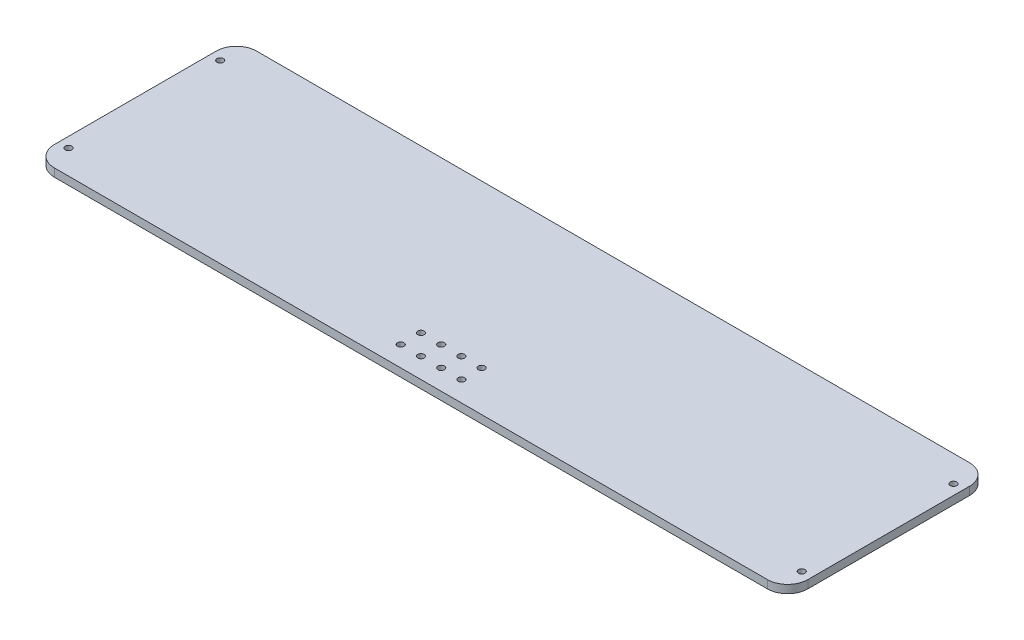
ISO-10303-21;
HEADER;
FILE_DESCRIPTION(('STEP AP214'),'2;1');
FILE_NAME('part.step','',(''),(''),'','','');
FILE_SCHEMA(('AUTOMOTIVE_DESIGN { 1 0 10303 214 1 1 1 1 }'));
ENDSEC;
DATA;
#1=APPLICATION_CONTEXT('core data for automotive mechanical design processes');
#2=APPLICATION_PROTOCOL_DEFINITION('international standard','automotive_design',2000,#1);
#3=PRODUCT_CONTEXT('',#1,'mechanical');
#4=PRODUCT('Part','Part','',(#3));
#5=PRODUCT_RELATED_PRODUCT_CATEGORY('part','',(#4));
#6=PRODUCT_DEFINITION_FORMATION('','',#4);
#7=PRODUCT_DEFINITION_CONTEXT('part definition',#1,'design');
#8=PRODUCT_DEFINITION('design','',#6,#7);
#9=PRODUCT_DEFINITION_SHAPE('','',#8);
#10=(LENGTH_UNIT() NAMED_UNIT(*) SI_UNIT(.MILLI.,.METRE.));
#11=(NAMED_UNIT(*) PLANE_ANGLE_UNIT() SI_UNIT($,.RADIAN.));
#12=(NAMED_UNIT(*) SI_UNIT($,.STERADIAN.) SOLID_ANGLE_UNIT());
#13=UNCERTAINTY_MEASURE_WITH_UNIT(LENGTH_MEASURE(1.E-05),#10,'distance_accuracy_value','');
#14=(GEOMETRIC_REPRESENTATION_CONTEXT(3) GLOBAL_UNCERTAINTY_ASSIGNED_CONTEXT((#13)) GLOBAL_UNIT_ASSIGNED_CONTEXT((#10,
#11,#12)) REPRESENTATION_CONTEXT('',''));
#15=CARTESIAN_POINT('',(0.,0.,0.));
#16=DIRECTION('',(0.,0.,1.));
#17=DIRECTION('',(1.,0.,0.));
#18=AXIS2_PLACEMENT_3D('',#15,#16,#17);
#19=CARTESIAN_POINT('',(-176.25,4.,40.));
#20=DIRECTION('',(0.,1.,0.));
#21=DIRECTION('',(0.,0.,1.));
#22=AXIS2_PLACEMENT_3D('',#19,#20,#21);
#23=PLANE('',#22);
#24=CARTESIAN_POINT('',(15.,4.,30.));
#25=DIRECTION('',(0.,1.,0.));
#26=DIRECTION('',(0.,0.,1.));
#27=AXIS2_PLACEMENT_3D('',#24,#25,#26);
#28=CIRCLE('',#27,1.6);
#29=CARTESIAN_POINT('',(15.,4.,31.6));
#30=VERTEX_POINT('',#29);
#31=EDGE_CURVE('E230',#30,#30,#28,.T.);
#32=ORIENTED_EDGE('',*,*,#31,.F.);
#33=EDGE_LOOP('',(#32));
#34=FACE_BOUND('',#33,.T.);
#35=CARTESIAN_POINT('',(15.,4.,40.));
#36=DIRECTION('',(0.,1.,0.));
#37=DIRECTION('',(0.,0.,1.));
#38=AXIS2_PLACEMENT_3D('',#35,#36,#37);
#39=CIRCLE('',#38,1.6);
#40=CARTESIAN_POINT('',(15.,4.,41.6));
#41=VERTEX_POINT('',#40);
#42=EDGE_CURVE('E224',#41,#41,#39,.T.);
#43=ORIENTED_EDGE('',*,*,#42,.F.);
#44=EDGE_LOOP('',(#43));
#45=FACE_BOUND('',#44,.T.);
#46=CARTESIAN_POINT('',(-15.,4.,40.));
#47=DIRECTION('',(0.,1.,0.));
#48=DIRECTION('',(0.,0.,1.));
#49=AXIS2_PLACEMENT_3D('',#46,#47,#48);
#50=CIRCLE('',#49,1.6);
#51=CARTESIAN_POINT('',(-15.,4.,41.6));
#52=VERTEX_POINT('',#51);
#53=EDGE_CURVE('E218',#52,#52,#50,.T.);
#54=ORIENTED_EDGE('',*,*,#53,.F.);
#55=EDGE_LOOP('',(#54));
#56=FACE_BOUND('',#55,.T.);
#57=CARTESIAN_POINT('',(-5.,4.,30.));
#58=DIRECTION('',(0.,1.,0.));
#59=DIRECTION('',(0.,0.,1.));
#60=AXIS2_PLACEMENT_3D('',#57,#58,#59);
#61=CIRCLE('',#60,1.6);
#62=CARTESIAN_POINT('',(-5.,4.,31.6));
#63=VERTEX_POINT('',#62);
#64=EDGE_CURVE('E211',#63,#63,#61,.T.);
#65=ORIENTED_EDGE('',*,*,#64,.F.);
#66=EDGE_LOOP('',(#65));
#67=FACE_BOUND('',#66,.T.);
#68=CARTESIAN_POINT('',(5.00000000000001,4.,40.));
#69=DIRECTION('',(0.,1.,0.));
#70=DIRECTION('',(0.,0.,1.));
#71=AXIS2_PLACEMENT_3D('',#68,#69,#70);
#72=CIRCLE('',#71,1.6);
#73=CARTESIAN_POINT('',(5.00000000000001,4.,41.6));
#74=VERTEX_POINT('',#73);
#75=EDGE_CURVE('E247',#74,#74,#72,.T.);
#76=ORIENTED_EDGE('',*,*,#75,.F.);
#77=EDGE_LOOP('',(#76));
#78=FACE_BOUND('',#77,.T.);
#79=CARTESIAN_POINT('',(-4.99999999999999,4.,40.));
#80=DIRECTION('',(0.,1.,0.));
#81=DIRECTION('',(0.,0.,1.));
#82=AXIS2_PLACEMENT_3D('',#79,#80,#81);
#83=CIRCLE('',#82,1.6);
#84=CARTESIAN_POINT('',(-4.99999999999999,4.,41.6));
#85=VERTEX_POINT('',#84);
#86=EDGE_CURVE('E235',#85,#85,#83,.T.);
#87=ORIENTED_EDGE('',*,*,#86,.F.);
#88=EDGE_LOOP('',(#87));
#89=FACE_BOUND('',#88,.T.);
#90=CARTESIAN_POINT('',(5.,4.,30.));
#91=DIRECTION('',(0.,1.,0.));
#92=DIRECTION('',(0.,0.,1.));
#93=AXIS2_PLACEMENT_3D('',#90,#91,#92);
#94=CIRCLE('',#93,1.6);
#95=CARTESIAN_POINT('',(5.,4.,31.6));
#96=VERTEX_POINT('',#95);
#97=EDGE_CURVE('E242',#96,#96,#94,.T.);
#98=ORIENTED_EDGE('',*,*,#97,.F.);
#99=EDGE_LOOP('',(#98));
#100=FACE_BOUND('',#99,.T.);
#101=CARTESIAN_POINT('',(-15.,4.,30.));
#102=DIRECTION('',(0.,1.,0.));
#103=DIRECTION('',(0.,0.,1.));
#104=AXIS2_PLACEMENT_3D('',#101,#102,#103);
#105=CIRCLE('',#104,1.6);
#106=CARTESIAN_POINT('',(-15.,4.,31.6));
#107=VERTEX_POINT('',#106);
#108=EDGE_CURVE('E205',#107,#107,#105,.T.);
#109=ORIENTED_EDGE('',*,*,#108,.F.);
#110=EDGE_LOOP('',(#109));
#111=FACE_BOUND('',#110,.T.);
#112=CARTESIAN_POINT('',(-181.25,4.,38.));
#113=DIRECTION('',(0.,1.,0.));
#114=DIRECTION('',(0.,0.,-1.));
#115=AXIS2_PLACEMENT_3D('',#112,#113,#114);
#116=CIRCLE('',#115,1.59999999999999);
#117=CARTESIAN_POINT('',(-181.25,4.,36.4));
#118=VERTEX_POINT('',#117);
#119=EDGE_CURVE('E190',#118,#118,#116,.T.);
#120=ORIENTED_EDGE('',*,*,#119,.F.);
#121=EDGE_LOOP('',(#120));
#122=FACE_BOUND('',#121,.T.);
#123=CARTESIAN_POINT('',(181.25,4.,38.));
#124=DIRECTION('',(0.,1.,0.));
#125=DIRECTION('',(0.,0.,1.));
#126=AXIS2_PLACEMENT_3D('',#123,#124,#125);
#127=CIRCLE('',#126,1.59999999999999);
#128=CARTESIAN_POINT('',(181.25,4.,39.6));
#129=VERTEX_POINT('',#128);
#130=EDGE_CURVE('E136',#129,#129,#127,.T.);
#131=ORIENTED_EDGE('',*,*,#130,.F.);
#132=EDGE_LOOP('',(#131));
#133=FACE_BOUND('',#132,.T.);
#134=CARTESIAN_POINT('',(-176.25,4.,40.));
#135=DIRECTION('',(0.,1.,0.));
#136=DIRECTION('',(0.,0.,1.));
#137=AXIS2_PLACEMENT_3D('',#134,#135,#136);
#138=CIRCLE('',#137,10.);
#139=CARTESIAN_POINT('',(-186.25,4.,39.9999999999999));
#140=VERTEX_POINT('',#139);
#141=CARTESIAN_POINT('',(-176.25,4.,50.));
#142=VERTEX_POINT('',#141);
#143=EDGE_CURVE('E147',#140,#142,#138,.T.);
#144=ORIENTED_EDGE('',*,*,#143,.T.);
#145=DIRECTION('',(1.,0.,0.));
#146=VECTOR('',#145,1.);
#147=CARTESIAN_POINT('',(-176.25,4.,50.));
#148=LINE('',#147,#146);
#149=CARTESIAN_POINT('',(176.25,4.,50.));
#150=VERTEX_POINT('',#149);
#151=EDGE_CURVE('E95',#142,#150,#148,.T.);
#152=ORIENTED_EDGE('',*,*,#151,.T.);
#153=CARTESIAN_POINT('',(176.25,4.,40.));
#154=DIRECTION('',(0.,1.,0.));
#155=DIRECTION('',(0.,0.,1.));
#156=AXIS2_PLACEMENT_3D('',#153,#154,#155);
#157=CIRCLE('',#156,10.);
#158=CARTESIAN_POINT('',(186.25,4.,39.9999999999999));
#159=VERTEX_POINT('',#158);
#160=EDGE_CURVE('E162',#150,#159,#157,.T.);
#161=ORIENTED_EDGE('',*,*,#160,.T.);
#162=DIRECTION('',(0.,0.,-1.));
#163=VECTOR('',#162,1.);
#164=CARTESIAN_POINT('',(186.25,4.,-39.9999999999999));
#165=LINE('',#164,#163);
#166=CARTESIAN_POINT('',(186.25,4.,-39.9999999999999));
#167=VERTEX_POINT('',#166);
#168=EDGE_CURVE('E175',#159,#167,#165,.T.);
#169=ORIENTED_EDGE('',*,*,#168,.T.);
#170=CARTESIAN_POINT('',(176.25,4.,-40.));
#171=DIRECTION('',(0.,1.,0.));
#172=DIRECTION('',(0.,0.,-1.));
#173=AXIS2_PLACEMENT_3D('',#170,#171,#172);
#174=CIRCLE('',#173,10.);
#175=CARTESIAN_POINT('',(176.25,4.,-50.));
#176=VERTEX_POINT('',#175);
#177=EDGE_CURVE('E114',#167,#176,#174,.T.);
#178=ORIENTED_EDGE('',*,*,#177,.T.);
#179=DIRECTION('',(-1.,0.,0.));
#180=VECTOR('',#179,1.);
#181=CARTESIAN_POINT('',(-176.25,4.,-50.));
#182=LINE('',#181,#180);
#183=CARTESIAN_POINT('',(-176.25,4.,-50.));
#184=VERTEX_POINT('',#183);
#185=EDGE_CURVE('E108',#176,#184,#182,.T.);
#186=ORIENTED_EDGE('',*,*,#185,.T.);
#187=CARTESIAN_POINT('',(-176.25,4.,-40.));
#188=DIRECTION('',(0.,1.,0.));
#189=DIRECTION('',(0.,0.,1.));
#190=AXIS2_PLACEMENT_3D('',#187,#188,#189);
#191=CIRCLE('',#190,10.);
#192=CARTESIAN_POINT('',(-186.25,4.,-39.9999999999999));
#193=VERTEX_POINT('',#192);
#194=EDGE_CURVE('E112',#184,#193,#191,.T.);
#195=ORIENTED_EDGE('',*,*,#194,.T.);
#196=DIRECTION('',(0.,0.,1.));
#197=VECTOR('',#196,1.);
#198=CARTESIAN_POINT('',(-186.25,4.,-39.9999999999999));
#199=LINE('',#198,#197);
#200=EDGE_CURVE('E52',#193,#140,#199,.T.);
#201=ORIENTED_EDGE('',*,*,#200,.T.);
#202=EDGE_LOOP('',(#144,#152,#161,#169,#178,#186,#195,#201));
#203=FACE_BOUND('',#202,.T.);
#204=CARTESIAN_POINT('',(181.25,4.,-37.));
#205=DIRECTION('',(0.,1.,0.));
#206=DIRECTION('',(0.,0.,1.));
#207=AXIS2_PLACEMENT_3D('',#204,#205,#206);
#208=CIRCLE('',#207,1.59999999999999);
#209=CARTESIAN_POINT('',(181.25,4.,-35.4));
#210=VERTEX_POINT('',#209);
#211=EDGE_CURVE('E184',#210,#210,#208,.T.);
#212=ORIENTED_EDGE('',*,*,#211,.F.);
#213=EDGE_LOOP('',(#212));
#214=FACE_BOUND('',#213,.T.);
#215=CARTESIAN_POINT('',(-181.25,4.,-37.));
#216=DIRECTION('',(0.,1.,0.));
#217=DIRECTION('',(0.,0.,-1.));
#218=AXIS2_PLACEMENT_3D('',#215,#216,#217);
#219=CIRCLE('',#218,1.59999999999999);
#220=CARTESIAN_POINT('',(-181.25,4.,-38.6));
#221=VERTEX_POINT('',#220);
#222=EDGE_CURVE('E196',#221,#221,#219,.T.);
#223=ORIENTED_EDGE('',*,*,#222,.F.);
#224=EDGE_LOOP('',(#223));
#225=FACE_BOUND('',#224,.T.);
#226=ADVANCED_FACE('F35',(#34,#45,#56,#67,#78,#89,#100,#111,#122,#133,#203,#214,#225),#23,.T.);
#227=CARTESIAN_POINT('',(-176.25,0.,40.));
#228=DIRECTION('',(0.,1.,0.));
#229=DIRECTION('',(0.,0.,1.));
#230=AXIS2_PLACEMENT_3D('',#227,#228,#229);
#231=PLANE('',#230);
#232=CARTESIAN_POINT('',(-176.25,0.,40.));
#233=DIRECTION('',(0.,1.,0.));
#234=DIRECTION('',(0.,0.,1.));
#235=AXIS2_PLACEMENT_3D('',#232,#233,#234);
#236=CIRCLE('',#235,10.);
#237=CARTESIAN_POINT('',(-186.25,0.,39.9999999999999));
#238=VERTEX_POINT('',#237);
#239=CARTESIAN_POINT('',(-176.25,0.,50.));
#240=VERTEX_POINT('',#239);
#241=EDGE_CURVE('E132',#238,#240,#236,.T.);
#242=ORIENTED_EDGE('',*,*,#241,.F.);
#243=DIRECTION('',(0.,0.,1.));
#244=VECTOR('',#243,1.);
#245=CARTESIAN_POINT('',(-186.25,0.,-39.9999999999999));
#246=LINE('',#245,#244);
#247=CARTESIAN_POINT('',(-186.25,0.,-39.9999999999999));
#248=VERTEX_POINT('',#247);
#249=EDGE_CURVE('E87',#248,#238,#246,.T.);
#250=ORIENTED_EDGE('',*,*,#249,.F.);
#251=CARTESIAN_POINT('',(-176.25,0.,-40.));
#252=DIRECTION('',(0.,1.,0.));
#253=DIRECTION('',(0.,0.,1.));
#254=AXIS2_PLACEMENT_3D('',#251,#252,#253);
#255=CIRCLE('',#254,10.);
#256=CARTESIAN_POINT('',(-176.25,0.,-50.));
#257=VERTEX_POINT('',#256);
#258=EDGE_CURVE('E81',#257,#248,#255,.T.);
#259=ORIENTED_EDGE('',*,*,#258,.F.);
#260=DIRECTION('',(-1.,0.,0.));
#261=VECTOR('',#260,1.);
#262=CARTESIAN_POINT('',(-176.25,0.,-50.));
#263=LINE('',#262,#261);
#264=CARTESIAN_POINT('',(176.25,0.,-50.));
#265=VERTEX_POINT('',#264);
#266=EDGE_CURVE('E122',#265,#257,#263,.T.);
#267=ORIENTED_EDGE('',*,*,#266,.F.);
#268=CARTESIAN_POINT('',(176.25,0.,-40.));
#269=DIRECTION('',(0.,1.,0.));
#270=DIRECTION('',(0.,0.,-1.));
#271=AXIS2_PLACEMENT_3D('',#268,#269,#270);
#272=CIRCLE('',#271,10.);
#273=CARTESIAN_POINT('',(186.25,0.,-39.9999999999999));
#274=VERTEX_POINT('',#273);
#275=EDGE_CURVE('E142',#274,#265,#272,.T.);
#276=ORIENTED_EDGE('',*,*,#275,.F.);
#277=DIRECTION('',(0.,0.,-1.));
#278=VECTOR('',#277,1.);
#279=CARTESIAN_POINT('',(186.25,0.,-39.9999999999999));
#280=LINE('',#279,#278);
#281=CARTESIAN_POINT('',(186.25,0.,39.9999999999999));
#282=VERTEX_POINT('',#281);
#283=EDGE_CURVE('E140',#282,#274,#280,.T.);
#284=ORIENTED_EDGE('',*,*,#283,.F.);
#285=CARTESIAN_POINT('',(176.25,0.,40.));
#286=DIRECTION('',(0.,1.,0.));
#287=DIRECTION('',(0.,0.,1.));
#288=AXIS2_PLACEMENT_3D('',#285,#286,#287);
#289=CIRCLE('',#288,10.);
#290=CARTESIAN_POINT('',(176.25,0.,50.));
#291=VERTEX_POINT('',#290);
#292=EDGE_CURVE('E138',#291,#282,#289,.T.);
#293=ORIENTED_EDGE('',*,*,#292,.F.);
#294=DIRECTION('',(1.,0.,0.));
#295=VECTOR('',#294,1.);
#296=CARTESIAN_POINT('',(-176.25,0.,50.));
#297=LINE('',#296,#295);
#298=EDGE_CURVE('E135',#240,#291,#297,.T.);
#299=ORIENTED_EDGE('',*,*,#298,.F.);
#300=EDGE_LOOP('',(#242,#250,#259,#267,#276,#284,#293,#299));
#301=FACE_BOUND('',#300,.T.);
#302=CARTESIAN_POINT('',(181.25,0.,38.));
#303=DIRECTION('',(0.,1.,0.));
#304=DIRECTION('',(0.,0.,1.));
#305=AXIS2_PLACEMENT_3D('',#302,#303,#304);
#306=CIRCLE('',#305,1.59999999999999);
#307=CARTESIAN_POINT('',(181.25,0.,39.6));
#308=VERTEX_POINT('',#307);
#309=EDGE_CURVE('E181',#308,#308,#306,.T.);
#310=ORIENTED_EDGE('',*,*,#309,.T.);
#311=EDGE_LOOP('',(#310));
#312=FACE_BOUND('',#311,.T.);
#313=CARTESIAN_POINT('',(181.25,0.,-37.));
#314=DIRECTION('',(0.,1.,0.));
#315=DIRECTION('',(0.,0.,1.));
#316=AXIS2_PLACEMENT_3D('',#313,#314,#315);
#317=CIRCLE('',#316,1.59999999999999);
#318=CARTESIAN_POINT('',(181.25,0.,-35.4));
#319=VERTEX_POINT('',#318);
#320=EDGE_CURVE('E187',#319,#319,#317,.T.);
#321=ORIENTED_EDGE('',*,*,#320,.T.);
#322=EDGE_LOOP('',(#321));
#323=FACE_BOUND('',#322,.T.);
#324=CARTESIAN_POINT('',(-181.25,0.,38.));
#325=DIRECTION('',(0.,1.,0.));
#326=DIRECTION('',(0.,0.,-1.));
#327=AXIS2_PLACEMENT_3D('',#324,#325,#326);
#328=CIRCLE('',#327,1.59999999999999);
#329=CARTESIAN_POINT('',(-181.25,0.,36.4));
#330=VERTEX_POINT('',#329);
#331=EDGE_CURVE('E193',#330,#330,#328,.T.);
#332=ORIENTED_EDGE('',*,*,#331,.T.);
#333=EDGE_LOOP('',(#332));
#334=FACE_BOUND('',#333,.T.);
#335=CARTESIAN_POINT('',(-181.25,0.,-37.));
#336=DIRECTION('',(0.,1.,0.));
#337=DIRECTION('',(0.,0.,-1.));
#338=AXIS2_PLACEMENT_3D('',#335,#336,#337);
#339=CIRCLE('',#338,1.59999999999999);
#340=CARTESIAN_POINT('',(-181.25,0.,-38.6));
#341=VERTEX_POINT('',#340);
#342=EDGE_CURVE('E199',#341,#341,#339,.T.);
#343=ORIENTED_EDGE('',*,*,#342,.T.);
#344=EDGE_LOOP('',(#343));
#345=FACE_BOUND('',#344,.T.);
#346=ADVANCED_FACE('F166',(#301,#312,#323,#334,#345),#231,.F.);
#347=CARTESIAN_POINT('',(-176.25,4.,40.));
#348=DIRECTION('',(0.,-1.,0.));
#349=DIRECTION('',(0.,0.,-1.));
#350=AXIS2_PLACEMENT_3D('',#347,#348,#349);
#351=CYLINDRICAL_SURFACE('',#350,10.);
#352=ORIENTED_EDGE('',*,*,#241,.T.);
#353=DIRECTION('',(0.,-1.,0.));
#354=VECTOR('',#353,1.);
#355=CARTESIAN_POINT('',(-176.25,4.,50.));
#356=LINE('',#355,#354);
#357=EDGE_CURVE('E11',#142,#240,#356,.T.);
#358=ORIENTED_EDGE('',*,*,#357,.F.);
#359=ORIENTED_EDGE('',*,*,#143,.F.);
#360=DIRECTION('',(0.,-1.,0.));
#361=VECTOR('',#360,1.);
#362=CARTESIAN_POINT('',(-186.25,4.,39.9999999999999));
#363=LINE('',#362,#361);
#364=EDGE_CURVE('E128',#140,#238,#363,.T.);
#365=ORIENTED_EDGE('',*,*,#364,.T.);
#366=EDGE_LOOP('',(#352,#358,#359,#365));
#367=FACE_BOUND('',#366,.T.);
#368=ADVANCED_FACE('F37',(#367),#351,.T.);
#369=CARTESIAN_POINT('',(-176.25,4.,50.));
#370=DIRECTION('',(0.,0.,-1.));
#371=DIRECTION('',(-1.,0.,0.));
#372=AXIS2_PLACEMENT_3D('',#369,#370,#371);
#373=PLANE('',#372);
#374=ORIENTED_EDGE('',*,*,#298,.T.);
#375=DIRECTION('',(0.,-1.,0.));
#376=VECTOR('',#375,1.);
#377=CARTESIAN_POINT('',(176.25,4.,50.));
#378=LINE('',#377,#376);
#379=EDGE_CURVE('E44',#150,#291,#378,.T.);
#380=ORIENTED_EDGE('',*,*,#379,.F.);
#381=ORIENTED_EDGE('',*,*,#151,.F.);
#382=ORIENTED_EDGE('',*,*,#357,.T.);
#383=EDGE_LOOP('',(#374,#380,#381,#382));
#384=FACE_BOUND('',#383,.T.);
#385=ADVANCED_FACE('F323',(#384),#373,.F.);
#386=CARTESIAN_POINT('',(176.25,4.,40.));
#387=DIRECTION('',(0.,-1.,0.));
#388=DIRECTION('',(0.,0.,-1.));
#389=AXIS2_PLACEMENT_3D('',#386,#387,#388);
#390=CYLINDRICAL_SURFACE('',#389,10.);
#391=ORIENTED_EDGE('',*,*,#292,.T.);
#392=DIRECTION('',(0.,-1.,0.));
#393=VECTOR('',#392,1.);
#394=CARTESIAN_POINT('',(186.25,4.,39.9999999999999));
#395=LINE('',#394,#393);
#396=EDGE_CURVE('E154',#159,#282,#395,.T.);
#397=ORIENTED_EDGE('',*,*,#396,.F.);
#398=ORIENTED_EDGE('',*,*,#160,.F.);
#399=ORIENTED_EDGE('',*,*,#379,.T.);
#400=EDGE_LOOP('',(#391,#397,#398,#399));
#401=FACE_BOUND('',#400,.T.);
#402=ADVANCED_FACE('F160',(#401),#390,.T.);
#403=CARTESIAN_POINT('',(186.25,4.,-39.9999999999999));
#404=DIRECTION('',(-1.,0.,0.));
#405=DIRECTION('',(0.,0.,1.));
#406=AXIS2_PLACEMENT_3D('',#403,#404,#405);
#407=PLANE('',#406);
#408=ORIENTED_EDGE('',*,*,#283,.T.);
#409=DIRECTION('',(0.,-1.,0.));
#410=VECTOR('',#409,1.);
#411=CARTESIAN_POINT('',(186.25,4.,-39.9999999999999));
#412=LINE('',#411,#410);
#413=EDGE_CURVE('E151',#167,#274,#412,.T.);
#414=ORIENTED_EDGE('',*,*,#413,.F.);
#415=ORIENTED_EDGE('',*,*,#168,.F.);
#416=ORIENTED_EDGE('',*,*,#396,.T.);
#417=EDGE_LOOP('',(#408,#414,#415,#416));
#418=FACE_BOUND('',#417,.T.);
#419=ADVANCED_FACE('F171',(#418),#407,.F.);
#420=CARTESIAN_POINT('',(176.25,4.,-40.));
#421=DIRECTION('',(0.,-1.,0.));
#422=DIRECTION('',(0.,0.,-1.));
#423=AXIS2_PLACEMENT_3D('',#420,#421,#422);
#424=CYLINDRICAL_SURFACE('',#423,10.);
#425=ORIENTED_EDGE('',*,*,#275,.T.);
#426=DIRECTION('',(0.,-1.,0.));
#427=VECTOR('',#426,1.);
#428=CARTESIAN_POINT('',(176.25,4.,-50.));
#429=LINE('',#428,#427);
#430=EDGE_CURVE('E123',#176,#265,#429,.T.);
#431=ORIENTED_EDGE('',*,*,#430,.F.);
#432=ORIENTED_EDGE('',*,*,#177,.F.);
#433=ORIENTED_EDGE('',*,*,#413,.T.);
#434=EDGE_LOOP('',(#425,#431,#432,#433));
#435=FACE_BOUND('',#434,.T.);
#436=ADVANCED_FACE('F174',(#435),#424,.T.);
#437=CARTESIAN_POINT('',(-176.25,4.,-50.));
#438=DIRECTION('',(0.,0.,1.));
#439=DIRECTION('',(1.,0.,0.));
#440=AXIS2_PLACEMENT_3D('',#437,#438,#439);
#441=PLANE('',#440);
#442=ORIENTED_EDGE('',*,*,#266,.T.);
#443=DIRECTION('',(0.,-1.,0.));
#444=VECTOR('',#443,1.);
#445=CARTESIAN_POINT('',(-176.25,4.,-50.));
#446=LINE('',#445,#444);
#447=EDGE_CURVE('E119',#184,#257,#446,.T.);
#448=ORIENTED_EDGE('',*,*,#447,.F.);
#449=ORIENTED_EDGE('',*,*,#185,.F.);
#450=ORIENTED_EDGE('',*,*,#430,.T.);
#451=EDGE_LOOP('',(#442,#448,#449,#450));
#452=FACE_BOUND('',#451,.T.);
#453=ADVANCED_FACE('F120',(#452),#441,.F.);
#454=CARTESIAN_POINT('',(-176.25,4.,-40.));
#455=DIRECTION('',(0.,-1.,0.));
#456=DIRECTION('',(0.,0.,-1.));
#457=AXIS2_PLACEMENT_3D('',#454,#455,#456);
#458=CYLINDRICAL_SURFACE('',#457,10.);
#459=ORIENTED_EDGE('',*,*,#258,.T.);
#460=DIRECTION('',(0.,-1.,0.));
#461=VECTOR('',#460,1.);
#462=CARTESIAN_POINT('',(-186.25,4.,-39.9999999999999));
#463=LINE('',#462,#461);
#464=EDGE_CURVE('E124',#193,#248,#463,.T.);
#465=ORIENTED_EDGE('',*,*,#464,.F.);
#466=ORIENTED_EDGE('',*,*,#194,.F.);
#467=ORIENTED_EDGE('',*,*,#447,.T.);
#468=EDGE_LOOP('',(#459,#465,#466,#467));
#469=FACE_BOUND('',#468,.T.);
#470=ADVANCED_FACE('F126',(#469),#458,.T.);
#471=CARTESIAN_POINT('',(-186.25,4.,-39.9999999999999));
#472=DIRECTION('',(1.,0.,0.));
#473=DIRECTION('',(0.,0.,-1.));
#474=AXIS2_PLACEMENT_3D('',#471,#472,#473);
#475=PLANE('',#474);
#476=ORIENTED_EDGE('',*,*,#249,.T.);
#477=ORIENTED_EDGE('',*,*,#364,.F.);
#478=ORIENTED_EDGE('',*,*,#200,.F.);
#479=ORIENTED_EDGE('',*,*,#464,.T.);
#480=EDGE_LOOP('',(#476,#477,#478,#479));
#481=FACE_BOUND('',#480,.T.);
#482=ADVANCED_FACE('F280',(#481),#475,.F.);
#483=CARTESIAN_POINT('',(181.25,4.,38.));
#484=DIRECTION('',(0.,-1.,0.));
#485=DIRECTION('',(0.,0.,-1.));
#486=AXIS2_PLACEMENT_3D('',#483,#484,#485);
#487=CYLINDRICAL_SURFACE('',#486,1.59999999999999);
#488=ORIENTED_EDGE('',*,*,#130,.T.);
#489=EDGE_LOOP('',(#488));
#490=FACE_BOUND('',#489,.T.);
#491=ORIENTED_EDGE('',*,*,#309,.F.);
#492=EDGE_LOOP('',(#491));
#493=FACE_BOUND('',#492,.T.);
#494=ADVANCED_FACE('F276',(#490,#493),#487,.F.);
#495=CARTESIAN_POINT('',(181.25,4.,-37.));
#496=DIRECTION('',(0.,-1.,0.));
#497=DIRECTION('',(0.,0.,-1.));
#498=AXIS2_PLACEMENT_3D('',#495,#496,#497);
#499=CYLINDRICAL_SURFACE('',#498,1.59999999999999);
#500=ORIENTED_EDGE('',*,*,#211,.T.);
#501=EDGE_LOOP('',(#500));
#502=FACE_BOUND('',#501,.T.);
#503=ORIENTED_EDGE('',*,*,#320,.F.);
#504=EDGE_LOOP('',(#503));
#505=FACE_BOUND('',#504,.T.);
#506=ADVANCED_FACE('F279',(#502,#505),#499,.F.);
#507=CARTESIAN_POINT('',(-181.25,4.,38.));
#508=DIRECTION('',(0.,-1.,0.));
#509=DIRECTION('',(0.,0.,-1.));
#510=AXIS2_PLACEMENT_3D('',#507,#508,#509);
#511=CYLINDRICAL_SURFACE('',#510,1.59999999999999);
#512=ORIENTED_EDGE('',*,*,#119,.T.);
#513=EDGE_LOOP('',(#512));
#514=FACE_BOUND('',#513,.T.);
#515=ORIENTED_EDGE('',*,*,#331,.F.);
#516=EDGE_LOOP('',(#515));
#517=FACE_BOUND('',#516,.T.);
#518=ADVANCED_FACE('F295',(#514,#517),#511,.F.);
#519=CARTESIAN_POINT('',(-181.25,4.,-37.));
#520=DIRECTION('',(0.,-1.,0.));
#521=DIRECTION('',(0.,0.,-1.));
#522=AXIS2_PLACEMENT_3D('',#519,#520,#521);
#523=CYLINDRICAL_SURFACE('',#522,1.59999999999999);
#524=ORIENTED_EDGE('',*,*,#222,.T.);
#525=EDGE_LOOP('',(#524));
#526=FACE_BOUND('',#525,.T.);
#527=ORIENTED_EDGE('',*,*,#342,.F.);
#528=EDGE_LOOP('',(#527));
#529=FACE_BOUND('',#528,.T.);
#530=ADVANCED_FACE('F292',(#526,#529),#523,.F.);
#531=CARTESIAN_POINT('',(-15.,1.,30.));
#532=DIRECTION('',(0.,1.,0.));
#533=DIRECTION('',(0.,0.,1.));
#534=AXIS2_PLACEMENT_3D('',#531,#532,#533);
#535=CYLINDRICAL_SURFACE('',#534,1.6);
#536=CARTESIAN_POINT('',(-15.,1.,30.));
#537=DIRECTION('',(0.,1.,0.));
#538=DIRECTION('',(0.,0.,1.));
#539=AXIS2_PLACEMENT_3D('',#536,#537,#538);
#540=CIRCLE('',#539,1.6);
#541=CARTESIAN_POINT('',(-15.,1.,31.6));
#542=VERTEX_POINT('',#541);
#543=EDGE_CURVE('E202',#542,#542,#540,.T.);
#544=ORIENTED_EDGE('',*,*,#543,.F.);
#545=EDGE_LOOP('',(#544));
#546=FACE_BOUND('',#545,.T.);
#547=ORIENTED_EDGE('',*,*,#108,.T.);
#548=EDGE_LOOP('',(#547));
#549=FACE_BOUND('',#548,.T.);
#550=ADVANCED_FACE('F294',(#546,#549),#535,.F.);
#551=CARTESIAN_POINT('',(-15.,1.,30.));
#552=DIRECTION('',(0.,1.,0.));
#553=DIRECTION('',(0.,0.,1.));
#554=AXIS2_PLACEMENT_3D('',#551,#552,#553);
#555=PLANE('',#554);
#556=ORIENTED_EDGE('',*,*,#543,.T.);
#557=EDGE_LOOP('',(#556));
#558=FACE_BOUND('',#557,.T.);
#559=ADVANCED_FACE('F302',(#558),#555,.T.);
#560=CARTESIAN_POINT('',(5.,1.,30.));
#561=DIRECTION('',(0.,1.,0.));
#562=DIRECTION('',(0.,0.,1.));
#563=AXIS2_PLACEMENT_3D('',#560,#561,#562);
#564=CYLINDRICAL_SURFACE('',#563,1.6);
#565=CARTESIAN_POINT('',(5.,1.,30.));
#566=DIRECTION('',(0.,1.,0.));
#567=DIRECTION('',(0.,0.,1.));
#568=AXIS2_PLACEMENT_3D('',#565,#566,#567);
#569=CIRCLE('',#568,1.6);
#570=CARTESIAN_POINT('',(5.,1.,31.6));
#571=VERTEX_POINT('',#570);
#572=EDGE_CURVE('E215',#571,#571,#569,.T.);
#573=ORIENTED_EDGE('',*,*,#572,.F.);
#574=EDGE_LOOP('',(#573));
#575=FACE_BOUND('',#574,.T.);
#576=ORIENTED_EDGE('',*,*,#97,.T.);
#577=EDGE_LOOP('',(#576));
#578=FACE_BOUND('',#577,.T.);
#579=ADVANCED_FACE('F359',(#575,#578),#564,.F.);
#580=CARTESIAN_POINT('',(5.,1.,30.));
#581=DIRECTION('',(0.,1.,0.));
#582=DIRECTION('',(0.,0.,1.));
#583=AXIS2_PLACEMENT_3D('',#580,#581,#582);
#584=PLANE('',#583);
#585=ORIENTED_EDGE('',*,*,#572,.T.);
#586=EDGE_LOOP('',(#585));
#587=FACE_BOUND('',#586,.T.);
#588=ADVANCED_FACE('F368',(#587),#584,.T.);
#589=CARTESIAN_POINT('',(-4.99999999999999,1.,40.));
#590=DIRECTION('',(0.,1.,0.));
#591=DIRECTION('',(0.,0.,1.));
#592=AXIS2_PLACEMENT_3D('',#589,#590,#591);
#593=CYLINDRICAL_SURFACE('',#592,1.6);
#594=CARTESIAN_POINT('',(-4.99999999999999,1.,40.));
#595=DIRECTION('',(0.,1.,0.));
#596=DIRECTION('',(0.,0.,1.));
#597=AXIS2_PLACEMENT_3D('',#594,#595,#596);
#598=CIRCLE('',#597,1.6);
#599=CARTESIAN_POINT('',(-4.99999999999999,1.,41.6));
#600=VERTEX_POINT('',#599);
#601=EDGE_CURVE('E238',#600,#600,#598,.T.);
#602=ORIENTED_EDGE('',*,*,#601,.F.);
#603=EDGE_LOOP('',(#602));
#604=FACE_BOUND('',#603,.T.);
#605=ORIENTED_EDGE('',*,*,#86,.T.);
#606=EDGE_LOOP('',(#605));
#607=FACE_BOUND('',#606,.T.);
#608=ADVANCED_FACE('F378',(#604,#607),#593,.F.);
#609=CARTESIAN_POINT('',(-4.99999999999999,1.,40.));
#610=DIRECTION('',(0.,1.,0.));
#611=DIRECTION('',(0.,0.,1.));
#612=AXIS2_PLACEMENT_3D('',#609,#610,#611);
#613=PLANE('',#612);
#614=ORIENTED_EDGE('',*,*,#601,.T.);
#615=EDGE_LOOP('',(#614));
#616=FACE_BOUND('',#615,.T.);
#617=ADVANCED_FACE('F258',(#616),#613,.T.);
#618=CARTESIAN_POINT('',(5.00000000000001,1.,40.));
#619=DIRECTION('',(0.,1.,0.));
#620=DIRECTION('',(0.,0.,1.));
#621=AXIS2_PLACEMENT_3D('',#618,#619,#620);
#622=CYLINDRICAL_SURFACE('',#621,1.6);
#623=CARTESIAN_POINT('',(5.00000000000001,1.,40.));
#624=DIRECTION('',(0.,1.,0.));
#625=DIRECTION('',(0.,0.,1.));
#626=AXIS2_PLACEMENT_3D('',#623,#624,#625);
#627=CIRCLE('',#626,1.6);
#628=CARTESIAN_POINT('',(5.00000000000001,1.,41.6));
#629=VERTEX_POINT('',#628);
#630=EDGE_CURVE('E239',#629,#629,#627,.T.);
#631=ORIENTED_EDGE('',*,*,#630,.F.);
#632=EDGE_LOOP('',(#631));
#633=FACE_BOUND('',#632,.T.);
#634=ORIENTED_EDGE('',*,*,#75,.T.);
#635=EDGE_LOOP('',(#634));
#636=FACE_BOUND('',#635,.T.);
#637=ADVANCED_FACE('F255',(#633,#636),#622,.F.);
#638=CARTESIAN_POINT('',(5.00000000000001,1.,40.));
#639=DIRECTION('',(0.,1.,0.));
#640=DIRECTION('',(0.,0.,1.));
#641=AXIS2_PLACEMENT_3D('',#638,#639,#640);
#642=PLANE('',#641);
#643=ORIENTED_EDGE('',*,*,#630,.T.);
#644=EDGE_LOOP('',(#643));
#645=FACE_BOUND('',#644,.T.);
#646=ADVANCED_FACE('F253',(#645),#642,.T.);
#647=CARTESIAN_POINT('',(-5.,1.,30.));
#648=DIRECTION('',(0.,1.,0.));
#649=DIRECTION('',(0.,0.,1.));
#650=AXIS2_PLACEMENT_3D('',#647,#648,#649);
#651=CYLINDRICAL_SURFACE('',#650,1.6);
#652=CARTESIAN_POINT('',(-5.,1.,30.));
#653=DIRECTION('',(0.,1.,0.));
#654=DIRECTION('',(0.,0.,1.));
#655=AXIS2_PLACEMENT_3D('',#652,#653,#654);
#656=CIRCLE('',#655,1.6);
#657=CARTESIAN_POINT('',(-5.,1.,31.6));
#658=VERTEX_POINT('',#657);
#659=EDGE_CURVE('E214',#658,#658,#656,.T.);
#660=ORIENTED_EDGE('',*,*,#659,.F.);
#661=EDGE_LOOP('',(#660));
#662=FACE_BOUND('',#661,.T.);
#663=ORIENTED_EDGE('',*,*,#64,.T.);
#664=EDGE_LOOP('',(#663));
#665=FACE_BOUND('',#664,.T.);
#666=ADVANCED_FACE('F412',(#662,#665),#651,.F.);
#667=CARTESIAN_POINT('',(-5.,1.,30.));
#668=DIRECTION('',(0.,1.,0.));
#669=DIRECTION('',(0.,0.,1.));
#670=AXIS2_PLACEMENT_3D('',#667,#668,#669);
#671=PLANE('',#670);
#672=ORIENTED_EDGE('',*,*,#659,.T.);
#673=EDGE_LOOP('',(#672));
#674=FACE_BOUND('',#673,.T.);
#675=ADVANCED_FACE('F421',(#674),#671,.T.);
#676=CARTESIAN_POINT('',(-15.,1.,40.));
#677=DIRECTION('',(0.,1.,0.));
#678=DIRECTION('',(0.,0.,1.));
#679=AXIS2_PLACEMENT_3D('',#676,#677,#678);
#680=CYLINDRICAL_SURFACE('',#679,1.6);
#681=CARTESIAN_POINT('',(-15.,1.,40.));
#682=DIRECTION('',(0.,1.,0.));
#683=DIRECTION('',(0.,0.,1.));
#684=AXIS2_PLACEMENT_3D('',#681,#682,#683);
#685=CIRCLE('',#684,1.6);
#686=CARTESIAN_POINT('',(-15.,1.,41.6));
#687=VERTEX_POINT('',#686);
#688=EDGE_CURVE('E221',#687,#687,#685,.T.);
#689=ORIENTED_EDGE('',*,*,#688,.F.);
#690=EDGE_LOOP('',(#689));
#691=FACE_BOUND('',#690,.T.);
#692=ORIENTED_EDGE('',*,*,#53,.T.);
#693=EDGE_LOOP('',(#692));
#694=FACE_BOUND('',#693,.T.);
#695=ADVANCED_FACE('F431',(#691,#694),#680,.F.);
#696=CARTESIAN_POINT('',(-15.,1.,40.));
#697=DIRECTION('',(0.,1.,0.));
#698=DIRECTION('',(0.,0.,1.));
#699=AXIS2_PLACEMENT_3D('',#696,#697,#698);
#700=PLANE('',#699);
#701=ORIENTED_EDGE('',*,*,#688,.T.);
#702=EDGE_LOOP('',(#701));
#703=FACE_BOUND('',#702,.T.);
#704=ADVANCED_FACE('F441',(#703),#700,.T.);
#705=CARTESIAN_POINT('',(15.,1.,40.));
#706=DIRECTION('',(0.,1.,0.));
#707=DIRECTION('',(0.,0.,1.));
#708=AXIS2_PLACEMENT_3D('',#705,#706,#707);
#709=CYLINDRICAL_SURFACE('',#708,1.6);
#710=CARTESIAN_POINT('',(15.,1.,40.));
#711=DIRECTION('',(0.,1.,0.));
#712=DIRECTION('',(0.,0.,1.));
#713=AXIS2_PLACEMENT_3D('',#710,#711,#712);
#714=CIRCLE('',#713,1.6);
#715=CARTESIAN_POINT('',(15.,1.,41.6));
#716=VERTEX_POINT('',#715);
#717=EDGE_CURVE('E227',#716,#716,#714,.T.);
#718=ORIENTED_EDGE('',*,*,#717,.F.);
#719=EDGE_LOOP('',(#718));
#720=FACE_BOUND('',#719,.T.);
#721=ORIENTED_EDGE('',*,*,#42,.T.);
#722=EDGE_LOOP('',(#721));
#723=FACE_BOUND('',#722,.T.);
#724=ADVANCED_FACE('F451',(#720,#723),#709,.F.);
#725=CARTESIAN_POINT('',(15.,1.,40.));
#726=DIRECTION('',(0.,1.,0.));
#727=DIRECTION('',(0.,0.,1.));
#728=AXIS2_PLACEMENT_3D('',#725,#726,#727);
#729=PLANE('',#728);
#730=ORIENTED_EDGE('',*,*,#717,.T.);
#731=EDGE_LOOP('',(#730));
#732=FACE_BOUND('',#731,.T.);
#733=ADVANCED_FACE('F461',(#732),#729,.T.);
#734=CARTESIAN_POINT('',(15.,1.,30.));
#735=DIRECTION('',(0.,1.,0.));
#736=DIRECTION('',(0.,0.,1.));
#737=AXIS2_PLACEMENT_3D('',#734,#735,#736);
#738=CYLINDRICAL_SURFACE('',#737,1.6);
#739=CARTESIAN_POINT('',(15.,1.,30.));
#740=DIRECTION('',(0.,1.,0.));
#741=DIRECTION('',(0.,0.,1.));
#742=AXIS2_PLACEMENT_3D('',#739,#740,#741);
#743=CIRCLE('',#742,1.6);
#744=CARTESIAN_POINT('',(15.,1.,31.6));
#745=VERTEX_POINT('',#744);
#746=EDGE_CURVE('E208',#745,#745,#743,.T.);
#747=ORIENTED_EDGE('',*,*,#746,.F.);
#748=EDGE_LOOP('',(#747));
#749=FACE_BOUND('',#748,.T.);
#750=ORIENTED_EDGE('',*,*,#31,.T.);
#751=EDGE_LOOP('',(#750));
#752=FACE_BOUND('',#751,.T.);
#753=ADVANCED_FACE('F471',(#749,#752),#738,.F.);
#754=CARTESIAN_POINT('',(15.,1.,30.));
#755=DIRECTION('',(0.,1.,0.));
#756=DIRECTION('',(0.,0.,1.));
#757=AXIS2_PLACEMENT_3D('',#754,#755,#756);
#758=PLANE('',#757);
#759=ORIENTED_EDGE('',*,*,#746,.T.);
#760=EDGE_LOOP('',(#759));
#761=FACE_BOUND('',#760,.T.);
#762=ADVANCED_FACE('F481',(#761),#758,.T.);
#763=CLOSED_SHELL('',(#226,#346,#368,#385,#402,#419,#436,#453,#470,#482,#494,#506,#518,#530,
#550,#559,#579,#588,#608,#617,#637,#646,#666,#675,#695,#704,#724,#733,#753,#762));
#764=MANIFOLD_SOLID_BREP('B2',#763);
#765=ADVANCED_BREP_SHAPE_REPRESENTATION('',(#18,#764),#14);
#766=SHAPE_DEFINITION_REPRESENTATION(#9,#765);
ENDSEC;
END-ISO-10303-21;
